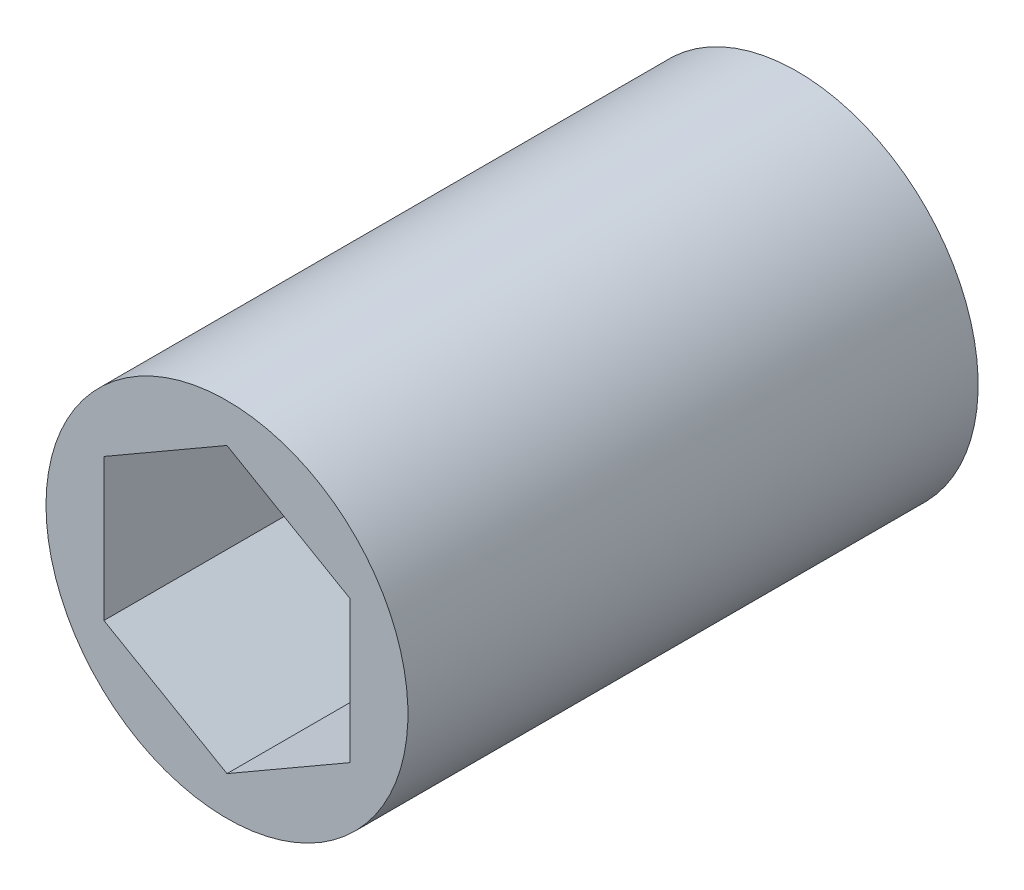
ISO-10303-21;
HEADER;
FILE_DESCRIPTION(('STEP AP214'),'2;1');
FILE_NAME('part.step','',(''),(''),'','','');
FILE_SCHEMA(('AUTOMOTIVE_DESIGN { 1 0 10303 214 1 1 1 1 }'));
ENDSEC;
DATA;
#1=APPLICATION_CONTEXT('core data for automotive mechanical design processes');
#2=APPLICATION_PROTOCOL_DEFINITION('international standard','automotive_design',2000,#1);
#3=PRODUCT_CONTEXT('',#1,'mechanical');
#4=PRODUCT('Part','Part','',(#3));
#5=PRODUCT_RELATED_PRODUCT_CATEGORY('part','',(#4));
#6=PRODUCT_DEFINITION_FORMATION('','',#4);
#7=PRODUCT_DEFINITION_CONTEXT('part definition',#1,'design');
#8=PRODUCT_DEFINITION('design','',#6,#7);
#9=PRODUCT_DEFINITION_SHAPE('','',#8);
#10=(LENGTH_UNIT() NAMED_UNIT(*) SI_UNIT(.MILLI.,.METRE.));
#11=(NAMED_UNIT(*) PLANE_ANGLE_UNIT() SI_UNIT($,.RADIAN.));
#12=(NAMED_UNIT(*) SI_UNIT($,.STERADIAN.) SOLID_ANGLE_UNIT());
#13=UNCERTAINTY_MEASURE_WITH_UNIT(LENGTH_MEASURE(1.E-05),#10,'distance_accuracy_value','');
#14=(GEOMETRIC_REPRESENTATION_CONTEXT(3) GLOBAL_UNCERTAINTY_ASSIGNED_CONTEXT((#13)) GLOBAL_UNIT_ASSIGNED_CONTEXT((#10,
#11,#12)) REPRESENTATION_CONTEXT('',''));
#15=CARTESIAN_POINT('',(0.,0.,0.));
#16=DIRECTION('',(0.,0.,1.));
#17=DIRECTION('',(1.,0.,0.));
#18=AXIS2_PLACEMENT_3D('',#15,#16,#17);
#19=CARTESIAN_POINT('',(0.,0.,30.01264));
#20=DIRECTION('',(0.,0.,1.));
#21=DIRECTION('',(1.,0.,0.));
#22=AXIS2_PLACEMENT_3D('',#19,#20,#21);
#23=PLANE('',#22);
#24=CARTESIAN_POINT('',(0.,0.,30.01264));
#25=DIRECTION('',(0.,0.,1.));
#26=DIRECTION('',(1.,0.,0.));
#27=AXIS2_PLACEMENT_3D('',#24,#25,#26);
#28=CIRCLE('',#27,9.525);
#29=CARTESIAN_POINT('',(-9.525,0.,30.01264));
#30=VERTEX_POINT('',#29);
#31=EDGE_CURVE('E11',#30,#30,#28,.T.);
#32=ORIENTED_EDGE('',*,*,#31,.T.);
#33=EDGE_LOOP('',(#32));
#34=FACE_BOUND('',#33,.T.);
#35=DIRECTION('',(-0.866025403784438,-0.500000000000001,0.));
#36=VECTOR('',#35,1.);
#37=CARTESIAN_POINT('',(0.,7.47899538708241,30.01264));
#38=LINE('',#37,#36);
#39=CARTESIAN_POINT('',(0.,7.47899538708241,30.01264));
#40=VERTEX_POINT('',#39);
#41=CARTESIAN_POINT('',(-6.47700000000001,3.73949769354119,30.01264));
#42=VERTEX_POINT('',#41);
#43=EDGE_CURVE('E108',#40,#42,#38,.T.);
#44=ORIENTED_EDGE('',*,*,#43,.F.);
#45=DIRECTION('',(-0.866025403784441,0.499999999999995,0.));
#46=VECTOR('',#45,1.);
#47=CARTESIAN_POINT('',(6.47699999999996,3.73949769354128,30.01264));
#48=LINE('',#47,#46);
#49=CARTESIAN_POINT('',(6.47699999999996,3.73949769354128,30.01264));
#50=VERTEX_POINT('',#49);
#51=EDGE_CURVE('E99',#50,#40,#48,.T.);
#52=ORIENTED_EDGE('',*,*,#51,.F.);
#53=DIRECTION('',(0.,1.,0.));
#54=VECTOR('',#53,1.);
#55=CARTESIAN_POINT('',(6.47700000000003,-3.73949769354114,30.01264));
#56=LINE('',#55,#54);
#57=CARTESIAN_POINT('',(6.47700000000003,-3.73949769354114,30.01264));
#58=VERTEX_POINT('',#57);
#59=EDGE_CURVE('E133',#58,#50,#56,.T.);
#60=ORIENTED_EDGE('',*,*,#59,.F.);
#61=DIRECTION('',(0.866025403784435,0.500000000000007,0.));
#62=VECTOR('',#61,1.);
#63=CARTESIAN_POINT('',(0.,-7.47899538708241,30.01264));
#64=LINE('',#63,#62);
#65=CARTESIAN_POINT('',(0.,-7.47899538708241,30.01264));
#66=VERTEX_POINT('',#65);
#67=EDGE_CURVE('E130',#66,#58,#64,.T.);
#68=ORIENTED_EDGE('',*,*,#67,.F.);
#69=DIRECTION('',(0.866025403784442,-0.499999999999995,0.));
#70=VECTOR('',#69,1.);
#71=CARTESIAN_POINT('',(-6.47699999999998,-3.73949769354123,30.01264));
#72=LINE('',#71,#70);
#73=CARTESIAN_POINT('',(-6.47699999999998,-3.73949769354123,30.01264));
#74=VERTEX_POINT('',#73);
#75=EDGE_CURVE('E125',#74,#66,#72,.T.);
#76=ORIENTED_EDGE('',*,*,#75,.F.);
#77=DIRECTION('',(0.,-1.,0.));
#78=VECTOR('',#77,1.);
#79=CARTESIAN_POINT('',(-6.47700000000001,3.73949769354119,30.01264));
#80=LINE('',#79,#78);
#81=EDGE_CURVE('E121',#42,#74,#80,.T.);
#82=ORIENTED_EDGE('',*,*,#81,.F.);
#83=EDGE_LOOP('',(#44,#52,#60,#68,#76,#82));
#84=FACE_BOUND('',#83,.T.);
#85=ADVANCED_FACE('F45',(#34,#84),#23,.T.);
#86=CARTESIAN_POINT('',(0.,0.,0.));
#87=DIRECTION('',(0.,0.,1.));
#88=DIRECTION('',(1.,0.,0.));
#89=AXIS2_PLACEMENT_3D('',#86,#87,#88);
#90=PLANE('',#89);
#91=CARTESIAN_POINT('',(0.,0.,0.));
#92=DIRECTION('',(0.,0.,1.));
#93=DIRECTION('',(1.,0.,0.));
#94=AXIS2_PLACEMENT_3D('',#91,#92,#93);
#95=CIRCLE('',#94,9.525);
#96=CARTESIAN_POINT('',(-9.525,0.,0.));
#97=VERTEX_POINT('',#96);
#98=EDGE_CURVE('E49',#97,#97,#95,.T.);
#99=ORIENTED_EDGE('',*,*,#98,.F.);
#100=EDGE_LOOP('',(#99));
#101=FACE_BOUND('',#100,.T.);
#102=DIRECTION('',(-0.866025403784441,0.499999999999995,0.));
#103=VECTOR('',#102,1.);
#104=CARTESIAN_POINT('',(6.47699999999996,3.73949769354128,0.));
#105=LINE('',#104,#103);
#106=CARTESIAN_POINT('',(6.47699999999996,3.73949769354128,0.));
#107=VERTEX_POINT('',#106);
#108=CARTESIAN_POINT('',(0.,7.47899538708241,0.));
#109=VERTEX_POINT('',#108);
#110=EDGE_CURVE('E69',#107,#109,#105,.T.);
#111=ORIENTED_EDGE('',*,*,#110,.T.);
#112=DIRECTION('',(-0.866025403784438,-0.500000000000001,0.));
#113=VECTOR('',#112,1.);
#114=CARTESIAN_POINT('',(0.,7.47899538708241,0.));
#115=LINE('',#114,#113);
#116=CARTESIAN_POINT('',(-6.47700000000001,3.73949769354119,0.));
#117=VERTEX_POINT('',#116);
#118=EDGE_CURVE('E115',#109,#117,#115,.T.);
#119=ORIENTED_EDGE('',*,*,#118,.T.);
#120=DIRECTION('',(0.,-1.,0.));
#121=VECTOR('',#120,1.);
#122=CARTESIAN_POINT('',(-6.47700000000001,3.73949769354119,0.));
#123=LINE('',#122,#121);
#124=CARTESIAN_POINT('',(-6.47699999999998,-3.73949769354123,0.));
#125=VERTEX_POINT('',#124);
#126=EDGE_CURVE('E140',#117,#125,#123,.T.);
#127=ORIENTED_EDGE('',*,*,#126,.T.);
#128=DIRECTION('',(0.866025403784442,-0.499999999999995,0.));
#129=VECTOR('',#128,1.);
#130=CARTESIAN_POINT('',(-6.47699999999998,-3.73949769354123,0.));
#131=LINE('',#130,#129);
#132=CARTESIAN_POINT('',(0.,-7.47899538708241,0.));
#133=VERTEX_POINT('',#132);
#134=EDGE_CURVE('E144',#125,#133,#131,.T.);
#135=ORIENTED_EDGE('',*,*,#134,.T.);
#136=DIRECTION('',(0.866025403784435,0.500000000000007,0.));
#137=VECTOR('',#136,1.);
#138=CARTESIAN_POINT('',(0.,-7.47899538708241,0.));
#139=LINE('',#138,#137);
#140=CARTESIAN_POINT('',(6.47700000000003,-3.73949769354114,0.));
#141=VERTEX_POINT('',#140);
#142=EDGE_CURVE('E148',#133,#141,#139,.T.);
#143=ORIENTED_EDGE('',*,*,#142,.T.);
#144=DIRECTION('',(0.,1.,0.));
#145=VECTOR('',#144,1.);
#146=CARTESIAN_POINT('',(6.47700000000003,-3.73949769354114,0.));
#147=LINE('',#146,#145);
#148=EDGE_CURVE('E109',#141,#107,#147,.T.);
#149=ORIENTED_EDGE('',*,*,#148,.T.);
#150=EDGE_LOOP('',(#111,#119,#127,#135,#143,#149));
#151=FACE_BOUND('',#150,.T.);
#152=ADVANCED_FACE('F172',(#101,#151),#90,.F.);
#153=CARTESIAN_POINT('',(0.,0.,30.01264));
#154=DIRECTION('',(0.,0.,-1.));
#155=DIRECTION('',(-1.,0.,0.));
#156=AXIS2_PLACEMENT_3D('',#153,#154,#155);
#157=CYLINDRICAL_SURFACE('',#156,9.525);
#158=CARTESIAN_POINT('',(-9.525,0.,30.01264));
#159=CARTESIAN_POINT('',(-9.525,0.,29.7000083333333));
#160=CARTESIAN_POINT('',(-9.525,0.,29.3873766666667));
#161=CARTESIAN_POINT('',(-9.525,0.,28.7621133333333));
#162=CARTESIAN_POINT('',(-9.525,0.,28.4494816666667));
#163=CARTESIAN_POINT('',(-9.525,0.,27.8242183333333));
#164=CARTESIAN_POINT('',(-9.525,0.,27.5115866666667));
#165=CARTESIAN_POINT('',(-9.525,0.,26.8863233333333));
#166=CARTESIAN_POINT('',(-9.525,0.,26.5736916666667));
#167=CARTESIAN_POINT('',(-9.525,0.,25.9484283333333));
#168=CARTESIAN_POINT('',(-9.525,0.,25.6357966666667));
#169=CARTESIAN_POINT('',(-9.525,0.,25.0105333333333));
#170=CARTESIAN_POINT('',(-9.525,0.,24.6979016666667));
#171=CARTESIAN_POINT('',(-9.525,0.,24.0726383333333));
#172=CARTESIAN_POINT('',(-9.525,0.,23.7600066666667));
#173=CARTESIAN_POINT('',(-9.525,0.,23.1347433333333));
#174=CARTESIAN_POINT('',(-9.525,0.,22.8221116666667));
#175=CARTESIAN_POINT('',(-9.525,0.,22.1968483333333));
#176=CARTESIAN_POINT('',(-9.525,0.,21.8842166666667));
#177=CARTESIAN_POINT('',(-9.525,0.,21.2589533333333));
#178=CARTESIAN_POINT('',(-9.525,0.,20.9463216666667));
#179=CARTESIAN_POINT('',(-9.525,0.,20.3210583333333));
#180=CARTESIAN_POINT('',(-9.525,0.,20.0084266666667));
#181=CARTESIAN_POINT('',(-9.525,0.,19.3831633333333));
#182=CARTESIAN_POINT('',(-9.525,0.,19.0705316666667));
#183=CARTESIAN_POINT('',(-9.525,0.,18.4452683333333));
#184=CARTESIAN_POINT('',(-9.525,0.,18.1326366666667));
#185=CARTESIAN_POINT('',(-9.525,0.,17.5073733333333));
#186=CARTESIAN_POINT('',(-9.525,0.,17.1947416666667));
#187=CARTESIAN_POINT('',(-9.525,0.,16.5694783333333));
#188=CARTESIAN_POINT('',(-9.525,0.,16.2568466666667));
#189=CARTESIAN_POINT('',(-9.525,0.,15.6315833333333));
#190=CARTESIAN_POINT('',(-9.525,0.,15.3189516666667));
#191=CARTESIAN_POINT('',(-9.525,0.,14.6936883333333));
#192=CARTESIAN_POINT('',(-9.525,0.,14.3810566666667));
#193=CARTESIAN_POINT('',(-9.525,0.,13.7557933333333));
#194=CARTESIAN_POINT('',(-9.525,0.,13.4431616666667));
#195=CARTESIAN_POINT('',(-9.525,0.,12.8178983333333));
#196=CARTESIAN_POINT('',(-9.525,0.,12.5052666666667));
#197=CARTESIAN_POINT('',(-9.525,0.,11.8800033333333));
#198=CARTESIAN_POINT('',(-9.525,0.,11.5673716666667));
#199=CARTESIAN_POINT('',(-9.525,0.,10.9421083333333));
#200=CARTESIAN_POINT('',(-9.525,0.,10.6294766666667));
#201=CARTESIAN_POINT('',(-9.525,0.,10.0042133333333));
#202=CARTESIAN_POINT('',(-9.525,0.,9.69158166666666));
#203=CARTESIAN_POINT('',(-9.525,0.,9.06631833333333));
#204=CARTESIAN_POINT('',(-9.525,0.,8.75368666666666));
#205=CARTESIAN_POINT('',(-9.525,0.,8.12842333333333));
#206=CARTESIAN_POINT('',(-9.525,0.,7.81579166666666));
#207=CARTESIAN_POINT('',(-9.525,0.,7.19052833333333));
#208=CARTESIAN_POINT('',(-9.525,0.,6.87789666666666));
#209=CARTESIAN_POINT('',(-9.525,0.,6.25263333333333));
#210=CARTESIAN_POINT('',(-9.525,0.,5.94000166666666));
#211=CARTESIAN_POINT('',(-9.525,0.,5.31473833333333));
#212=CARTESIAN_POINT('',(-9.525,0.,5.00210666666666));
#213=CARTESIAN_POINT('',(-9.525,0.,4.37684333333333));
#214=CARTESIAN_POINT('',(-9.525,0.,4.06421166666666));
#215=CARTESIAN_POINT('',(-9.525,0.,3.43894833333333));
#216=CARTESIAN_POINT('',(-9.525,0.,3.12631666666666));
#217=CARTESIAN_POINT('',(-9.525,0.,2.50105333333333));
#218=CARTESIAN_POINT('',(-9.525,0.,2.18842166666666));
#219=CARTESIAN_POINT('',(-9.525,0.,1.56315833333333));
#220=CARTESIAN_POINT('',(-9.525,0.,1.25052666666666));
#221=CARTESIAN_POINT('',(-9.525,0.,0.625263333333331));
#222=CARTESIAN_POINT('',(-9.525,0.,0.312631666666664));
#223=CARTESIAN_POINT('',(-9.525,0.,0.));
#224=B_SPLINE_CURVE_WITH_KNOTS('',3,(#158,#159,#160,#161,#162,#163,#164,#165,#166,#167,#168,
#169,#170,#171,#172,#173,#174,#175,#176,#177,#178,#179,#180,#181,#182,#183,#184,#185,#186,#187,
#188,#189,#190,#191,#192,#193,#194,#195,#196,#197,#198,#199,#200,#201,#202,#203,#204,#205,#206,
#207,#208,#209,#210,#211,#212,#213,#214,#215,#216,#217,#218,#219,#220,#221,#222,#223),
.UNSPECIFIED.,.F.,.F.,(4,2,2,2,2,2,2,2,2,2,2,2,2,2,2,2,2,2,2,2,2,2,2,2,2,2,2,2,2,2,2,2,4),(0.,
0.937894999999998,1.87579,2.813685,3.75158,4.689475,5.62737,6.565265,7.50316,8.441055,9.37895,
10.316845,11.25474,12.192635,13.13053,14.068425,15.00632,15.944215,16.88211,17.820005,18.7579,
19.695795,20.63369,21.571585,22.50948,23.447375,24.38527,25.323165,26.26106,27.198955,28.13685,
29.074745,30.01264),.UNSPECIFIED.);
#225=EDGE_CURVE('BSEAM47',#30,#97,#224,.T.);
#226=ORIENTED_EDGE('',*,*,#31,.F.);
#227=ORIENTED_EDGE('',*,*,#98,.T.);
#228=ORIENTED_EDGE('',*,*,#225,.T.);
#229=ORIENTED_EDGE('',*,*,#225,.F.);
#230=EDGE_LOOP('',(#226,#228,#227,#229));
#231=FACE_BOUND('',#230,.T.);
#232=ADVANCED_FACE('F47',(#231),#157,.T.);
#233=CARTESIAN_POINT('',(6.47699999999996,3.73949769354128,30.01264));
#234=DIRECTION('',(-0.499999999999995,-0.866025403784441,0.));
#235=DIRECTION('',(0.866025403784441,-0.499999999999995,0.));
#236=AXIS2_PLACEMENT_3D('',#233,#234,#235);
#237=PLANE('',#236);
#238=ORIENTED_EDGE('',*,*,#110,.F.);
#239=DIRECTION('',(0.,0.,-1.));
#240=VECTOR('',#239,1.);
#241=CARTESIAN_POINT('',(6.47699999999996,3.73949769354128,30.01264));
#242=LINE('',#241,#240);
#243=EDGE_CURVE('E103',#50,#107,#242,.T.);
#244=ORIENTED_EDGE('',*,*,#243,.F.);
#245=ORIENTED_EDGE('',*,*,#51,.T.);
#246=DIRECTION('',(0.,0.,-1.));
#247=VECTOR('',#246,1.);
#248=CARTESIAN_POINT('',(0.,7.47899538708241,30.01264));
#249=LINE('',#248,#247);
#250=EDGE_CURVE('E102',#40,#109,#249,.T.);
#251=ORIENTED_EDGE('',*,*,#250,.T.);
#252=EDGE_LOOP('',(#238,#244,#245,#251));
#253=FACE_BOUND('',#252,.T.);
#254=ADVANCED_FACE('F101',(#253),#237,.T.);
#255=CARTESIAN_POINT('',(0.,7.47899538708241,30.01264));
#256=DIRECTION('',(0.500000000000001,-0.866025403784438,0.));
#257=DIRECTION('',(0.866025403784438,0.500000000000001,0.));
#258=AXIS2_PLACEMENT_3D('',#255,#256,#257);
#259=PLANE('',#258);
#260=ORIENTED_EDGE('',*,*,#118,.F.);
#261=ORIENTED_EDGE('',*,*,#250,.F.);
#262=ORIENTED_EDGE('',*,*,#43,.T.);
#263=DIRECTION('',(0.,0.,-1.));
#264=VECTOR('',#263,1.);
#265=CARTESIAN_POINT('',(-6.47700000000001,3.73949769354119,30.01264));
#266=LINE('',#265,#264);
#267=EDGE_CURVE('E117',#42,#117,#266,.T.);
#268=ORIENTED_EDGE('',*,*,#267,.T.);
#269=EDGE_LOOP('',(#260,#261,#262,#268));
#270=FACE_BOUND('',#269,.T.);
#271=ADVANCED_FACE('F112',(#270),#259,.T.);
#272=CARTESIAN_POINT('',(-6.47700000000001,3.73949769354119,30.01264));
#273=DIRECTION('',(1.,0.,0.));
#274=DIRECTION('',(0.,1.,0.));
#275=AXIS2_PLACEMENT_3D('',#272,#273,#274);
#276=PLANE('',#275);
#277=ORIENTED_EDGE('',*,*,#126,.F.);
#278=ORIENTED_EDGE('',*,*,#267,.F.);
#279=ORIENTED_EDGE('',*,*,#81,.T.);
#280=DIRECTION('',(0.,0.,-1.));
#281=VECTOR('',#280,1.);
#282=CARTESIAN_POINT('',(-6.47699999999998,-3.73949769354123,30.01264));
#283=LINE('',#282,#281);
#284=EDGE_CURVE('E162',#74,#125,#283,.T.);
#285=ORIENTED_EDGE('',*,*,#284,.T.);
#286=EDGE_LOOP('',(#277,#278,#279,#285));
#287=FACE_BOUND('',#286,.T.);
#288=ADVANCED_FACE('F168',(#287),#276,.T.);
#289=CARTESIAN_POINT('',(-6.47699999999998,-3.73949769354123,30.01264));
#290=DIRECTION('',(0.499999999999995,0.866025403784441,0.));
#291=DIRECTION('',(-0.866025403784442,0.499999999999995,0.));
#292=AXIS2_PLACEMENT_3D('',#289,#290,#291);
#293=PLANE('',#292);
#294=ORIENTED_EDGE('',*,*,#134,.F.);
#295=ORIENTED_EDGE('',*,*,#284,.F.);
#296=ORIENTED_EDGE('',*,*,#75,.T.);
#297=DIRECTION('',(0.,0.,-1.));
#298=VECTOR('',#297,1.);
#299=CARTESIAN_POINT('',(0.,-7.47899538708241,30.01264));
#300=LINE('',#299,#298);
#301=EDGE_CURVE('E159',#66,#133,#300,.T.);
#302=ORIENTED_EDGE('',*,*,#301,.T.);
#303=EDGE_LOOP('',(#294,#295,#296,#302));
#304=FACE_BOUND('',#303,.T.);
#305=ADVANCED_FACE('F180',(#304),#293,.T.);
#306=CARTESIAN_POINT('',(0.,-7.47899538708241,30.01264));
#307=DIRECTION('',(-0.500000000000007,0.866025403784434,0.));
#308=DIRECTION('',(-0.866025403784435,-0.500000000000007,0.));
#309=AXIS2_PLACEMENT_3D('',#306,#307,#308);
#310=PLANE('',#309);
#311=ORIENTED_EDGE('',*,*,#142,.F.);
#312=ORIENTED_EDGE('',*,*,#301,.F.);
#313=ORIENTED_EDGE('',*,*,#67,.T.);
#314=DIRECTION('',(0.,0.,-1.));
#315=VECTOR('',#314,1.);
#316=CARTESIAN_POINT('',(6.47700000000003,-3.73949769354114,30.01264));
#317=LINE('',#316,#315);
#318=EDGE_CURVE('E61',#58,#141,#317,.T.);
#319=ORIENTED_EDGE('',*,*,#318,.T.);
#320=EDGE_LOOP('',(#311,#312,#313,#319));
#321=FACE_BOUND('',#320,.T.);
#322=ADVANCED_FACE('F178',(#321),#310,.T.);
#323=CARTESIAN_POINT('',(6.47700000000003,-3.73949769354114,30.01264));
#324=DIRECTION('',(-1.,0.,0.));
#325=DIRECTION('',(0.,-1.,0.));
#326=AXIS2_PLACEMENT_3D('',#323,#324,#325);
#327=PLANE('',#326);
#328=ORIENTED_EDGE('',*,*,#148,.F.);
#329=ORIENTED_EDGE('',*,*,#318,.F.);
#330=ORIENTED_EDGE('',*,*,#59,.T.);
#331=ORIENTED_EDGE('',*,*,#243,.T.);
#332=EDGE_LOOP('',(#328,#329,#330,#331));
#333=FACE_BOUND('',#332,.T.);
#334=ADVANCED_FACE('F174',(#333),#327,.T.);
#335=CLOSED_SHELL('',(#85,#152,#232,#254,#271,#288,#305,#322,#334));
#336=MANIFOLD_SOLID_BREP('B2',#335);
#337=ADVANCED_BREP_SHAPE_REPRESENTATION('',(#18,#336),#14);
#338=SHAPE_DEFINITION_REPRESENTATION(#9,#337);
ENDSEC;
END-ISO-10303-21;
